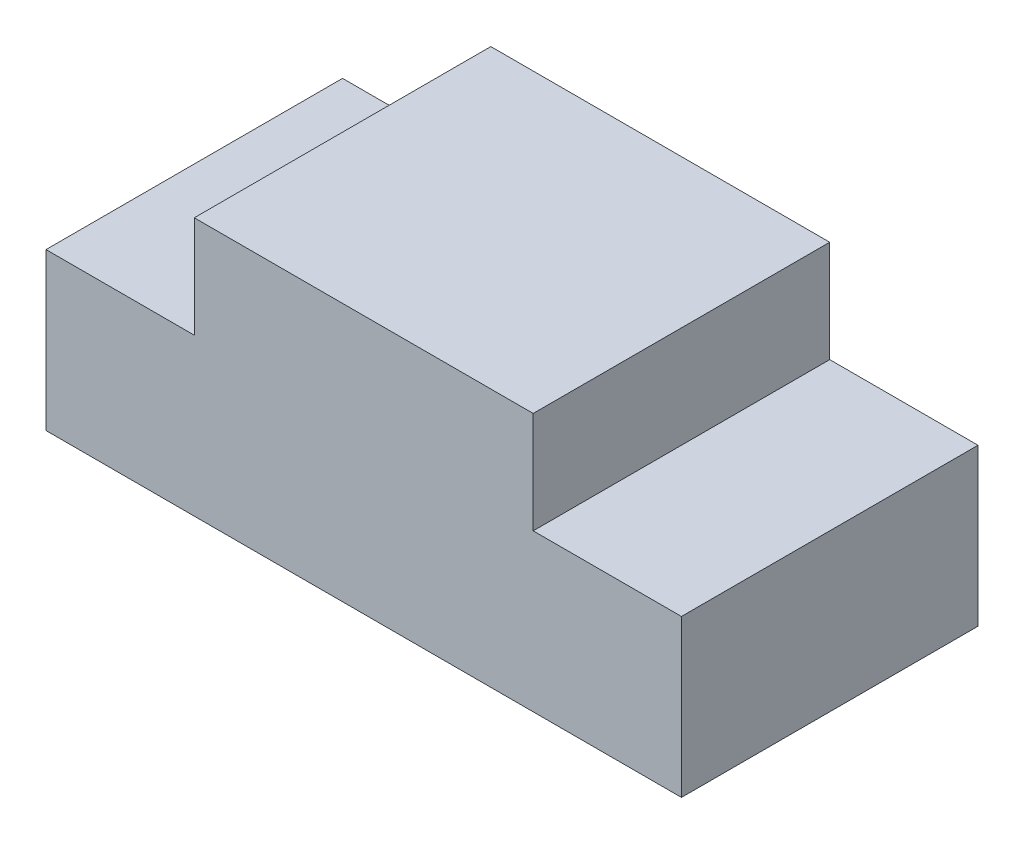
ISO-10303-21;
HEADER;
FILE_DESCRIPTION(('STEP AP214'),'2;1');
FILE_NAME('part.step','',(''),(''),'','','');
FILE_SCHEMA(('AUTOMOTIVE_DESIGN { 1 0 10303 214 1 1 1 1 }'));
ENDSEC;
DATA;
#1=APPLICATION_CONTEXT('core data for automotive mechanical design processes');
#2=APPLICATION_PROTOCOL_DEFINITION('international standard','automotive_design',2000,#1);
#3=PRODUCT_CONTEXT('',#1,'mechanical');
#4=PRODUCT('Part','Part','',(#3));
#5=PRODUCT_RELATED_PRODUCT_CATEGORY('part','',(#4));
#6=PRODUCT_DEFINITION_FORMATION('','',#4);
#7=PRODUCT_DEFINITION_CONTEXT('part definition',#1,'design');
#8=PRODUCT_DEFINITION('design','',#6,#7);
#9=PRODUCT_DEFINITION_SHAPE('','',#8);
#10=(LENGTH_UNIT() NAMED_UNIT(*) SI_UNIT(.MILLI.,.METRE.));
#11=(NAMED_UNIT(*) PLANE_ANGLE_UNIT() SI_UNIT($,.RADIAN.));
#12=(NAMED_UNIT(*) SI_UNIT($,.STERADIAN.) SOLID_ANGLE_UNIT());
#13=UNCERTAINTY_MEASURE_WITH_UNIT(LENGTH_MEASURE(1.E-05),#10,'distance_accuracy_value','');
#14=(GEOMETRIC_REPRESENTATION_CONTEXT(3) GLOBAL_UNCERTAINTY_ASSIGNED_CONTEXT((#13)) GLOBAL_UNIT_ASSIGNED_CONTEXT((#10,
#11,#12)) REPRESENTATION_CONTEXT('',''));
#15=CARTESIAN_POINT('',(0.,0.,0.));
#16=DIRECTION('',(0.,0.,1.));
#17=DIRECTION('',(1.,0.,0.));
#18=AXIS2_PLACEMENT_3D('',#15,#16,#17);
#19=CARTESIAN_POINT('',(0.,35.011641443539,0.));
#20=DIRECTION('',(0.,-1.,0.));
#21=DIRECTION('',(0.,0.,-1.));
#22=AXIS2_PLACEMENT_3D('',#19,#20,#21);
#23=PLANE('',#22);
#24=DIRECTION('',(0.,0.,1.));
#25=VECTOR('',#24,1.);
#26=CARTESIAN_POINT('',(41.0954598370198,35.011641443539,0.999999999999974));
#27=LINE('',#26,#25);
#28=CARTESIAN_POINT('',(41.0954598370198,35.011641443539,0.999999999999974));
#29=VERTEX_POINT('',#28);
#30=CARTESIAN_POINT('',(41.0954598370198,35.011641443539,69.));
#31=VERTEX_POINT('',#30);
#32=EDGE_CURVE('E162',#29,#31,#27,.T.);
#33=ORIENTED_EDGE('',*,*,#32,.F.);
#34=DIRECTION('',(-1.,0.,0.));
#35=VECTOR('',#34,1.);
#36=CARTESIAN_POINT('',(-71.9045401629802,35.011641443539,1.));
#37=LINE('',#36,#35);
#38=CARTESIAN_POINT('',(76.0954598370198,35.011641443539,1.));
#39=VERTEX_POINT('',#38);
#40=EDGE_CURVE('E265',#39,#29,#37,.T.);
#41=ORIENTED_EDGE('',*,*,#40,.F.);
#42=DIRECTION('',(0.,0.,-1.));
#43=VECTOR('',#42,1.);
#44=CARTESIAN_POINT('',(76.0954598370198,35.011641443539,69.));
#45=LINE('',#44,#43);
#46=CARTESIAN_POINT('',(76.0954598370198,35.011641443539,69.));
#47=VERTEX_POINT('',#46);
#48=EDGE_CURVE('E282',#47,#39,#45,.T.);
#49=ORIENTED_EDGE('',*,*,#48,.F.);
#50=DIRECTION('',(1.,0.,0.));
#51=VECTOR('',#50,1.);
#52=CARTESIAN_POINT('',(-71.9045401629802,35.011641443539,69.));
#53=LINE('',#52,#51);
#54=EDGE_CURVE('E278',#31,#47,#53,.T.);
#55=ORIENTED_EDGE('',*,*,#54,.F.);
#56=EDGE_LOOP('',(#33,#41,#49,#55));
#57=FACE_BOUND('',#56,.T.);
#58=ADVANCED_FACE('F39',(#57),#23,.T.);
#59=CARTESIAN_POINT('',(-72.9045401629802,35.011641443539,70.));
#60=DIRECTION('',(1.,0.,0.));
#61=DIRECTION('',(0.,1.,0.));
#62=AXIS2_PLACEMENT_3D('',#59,#60,#61);
#63=PLANE('',#62);
#64=DIRECTION('',(0.,-1.,0.));
#65=VECTOR('',#64,1.);
#66=CARTESIAN_POINT('',(-72.9045401629802,35.011641443539,0.));
#67=LINE('',#66,#65);
#68=CARTESIAN_POINT('',(-72.9045401629802,36.011641443539,0.));
#69=VERTEX_POINT('',#68);
#70=CARTESIAN_POINT('',(-72.9045401629802,-0.988358556461004,0.));
#71=VERTEX_POINT('',#70);
#72=EDGE_CURVE('E294',#69,#71,#67,.T.);
#73=ORIENTED_EDGE('',*,*,#72,.T.);
#74=DIRECTION('',(0.,0.,-1.));
#75=VECTOR('',#74,1.);
#76=CARTESIAN_POINT('',(-72.9045401629802,-0.988358556461004,70.));
#77=LINE('',#76,#75);
#78=CARTESIAN_POINT('',(-72.9045401629802,-0.988358556461004,70.));
#79=VERTEX_POINT('',#78);
#80=EDGE_CURVE('E11',#79,#71,#77,.T.);
#81=ORIENTED_EDGE('',*,*,#80,.F.);
#82=DIRECTION('',(0.,-1.,0.));
#83=VECTOR('',#82,1.);
#84=CARTESIAN_POINT('',(-72.9045401629802,35.011641443539,70.));
#85=LINE('',#84,#83);
#86=CARTESIAN_POINT('',(-72.9045401629802,36.011641443539,70.));
#87=VERTEX_POINT('',#86);
#88=EDGE_CURVE('E305',#87,#79,#85,.T.);
#89=ORIENTED_EDGE('',*,*,#88,.F.);
#90=DIRECTION('',(0.,0.,1.));
#91=VECTOR('',#90,1.);
#92=CARTESIAN_POINT('',(-72.9045401629802,36.011641443539,0.));
#93=LINE('',#92,#91);
#94=EDGE_CURVE('E251',#69,#87,#93,.T.);
#95=ORIENTED_EDGE('',*,*,#94,.F.);
#96=EDGE_LOOP('',(#73,#81,#89,#95));
#97=FACE_BOUND('',#96,.T.);
#98=ADVANCED_FACE('F41',(#97),#63,.F.);
#99=CARTESIAN_POINT('',(-72.9045401629802,-0.988358556461004,70.));
#100=DIRECTION('',(0.,1.,0.));
#101=DIRECTION('',(0.,0.,1.));
#102=AXIS2_PLACEMENT_3D('',#99,#100,#101);
#103=PLANE('',#102);
#104=DIRECTION('',(-1.,0.,0.));
#105=VECTOR('',#104,1.);
#106=CARTESIAN_POINT('',(-71.9045401629802,-0.988358556461004,1.));
#107=LINE('',#106,#105);
#108=CARTESIAN_POINT('',(76.0954598370198,-0.988358556461004,1.));
#109=VERTEX_POINT('',#108);
#110=CARTESIAN_POINT('',(-71.9045401629802,-0.988358556461004,1.));
#111=VERTEX_POINT('',#110);
#112=EDGE_CURVE('E271',#109,#111,#107,.T.);
#113=ORIENTED_EDGE('',*,*,#112,.T.);
#114=DIRECTION('',(0.,0.,1.));
#115=VECTOR('',#114,1.);
#116=CARTESIAN_POINT('',(-71.9045401629802,-0.988358556461004,69.));
#117=LINE('',#116,#115);
#118=CARTESIAN_POINT('',(-71.9045401629802,-0.988358556461004,69.));
#119=VERTEX_POINT('',#118);
#120=EDGE_CURVE('E260',#111,#119,#117,.T.);
#121=ORIENTED_EDGE('',*,*,#120,.T.);
#122=DIRECTION('',(1.,0.,0.));
#123=VECTOR('',#122,1.);
#124=CARTESIAN_POINT('',(-71.9045401629802,-0.988358556461004,69.));
#125=LINE('',#124,#123);
#126=CARTESIAN_POINT('',(76.0954598370198,-0.988358556461004,69.));
#127=VERTEX_POINT('',#126);
#128=EDGE_CURVE('E264',#119,#127,#125,.T.);
#129=ORIENTED_EDGE('',*,*,#128,.T.);
#130=DIRECTION('',(0.,0.,-1.));
#131=VECTOR('',#130,1.);
#132=CARTESIAN_POINT('',(76.0954598370198,-0.988358556461004,69.));
#133=LINE('',#132,#131);
#134=EDGE_CURVE('E63',#127,#109,#133,.T.);
#135=ORIENTED_EDGE('',*,*,#134,.T.);
#136=EDGE_LOOP('',(#113,#121,#129,#135));
#137=FACE_BOUND('',#136,.T.);
#138=DIRECTION('',(1.,0.,0.));
#139=VECTOR('',#138,1.);
#140=CARTESIAN_POINT('',(-72.9045401629802,-0.988358556461004,0.));
#141=LINE('',#140,#139);
#142=CARTESIAN_POINT('',(77.0954598370198,-0.988358556461004,0.));
#143=VERTEX_POINT('',#142);
#144=EDGE_CURVE('E319',#71,#143,#141,.T.);
#145=ORIENTED_EDGE('',*,*,#144,.T.);
#146=DIRECTION('',(0.,0.,-1.));
#147=VECTOR('',#146,1.);
#148=CARTESIAN_POINT('',(77.0954598370198,-0.988358556461004,70.));
#149=LINE('',#148,#147);
#150=CARTESIAN_POINT('',(77.0954598370198,-0.988358556461004,70.));
#151=VERTEX_POINT('',#150);
#152=EDGE_CURVE('E48',#151,#143,#149,.T.);
#153=ORIENTED_EDGE('',*,*,#152,.F.);
#154=DIRECTION('',(1.,0.,0.));
#155=VECTOR('',#154,1.);
#156=CARTESIAN_POINT('',(-72.9045401629802,-0.988358556461004,70.));
#157=LINE('',#156,#155);
#158=EDGE_CURVE('E309',#79,#151,#157,.T.);
#159=ORIENTED_EDGE('',*,*,#158,.F.);
#160=ORIENTED_EDGE('',*,*,#80,.T.);
#161=EDGE_LOOP('',(#145,#153,#159,#160));
#162=FACE_BOUND('',#161,.T.);
#163=ADVANCED_FACE('F345',(#137,#162),#103,.F.);
#164=CARTESIAN_POINT('',(77.0954598370198,35.011641443539,70.));
#165=DIRECTION('',(-1.,0.,0.));
#166=DIRECTION('',(0.,0.,1.));
#167=AXIS2_PLACEMENT_3D('',#164,#165,#166);
#168=PLANE('',#167);
#169=DIRECTION('',(0.,1.,0.));
#170=VECTOR('',#169,1.);
#171=CARTESIAN_POINT('',(77.0954598370198,35.011641443539,0.));
#172=LINE('',#171,#170);
#173=CARTESIAN_POINT('',(77.0954598370198,36.011641443539,0.));
#174=VERTEX_POINT('',#173);
#175=EDGE_CURVE('E310',#143,#174,#172,.T.);
#176=ORIENTED_EDGE('',*,*,#175,.T.);
#177=DIRECTION('',(0.,0.,-1.));
#178=VECTOR('',#177,1.);
#179=CARTESIAN_POINT('',(77.0954598370198,36.011641443539,0.));
#180=LINE('',#179,#178);
#181=CARTESIAN_POINT('',(77.0954598370198,36.011641443539,70.));
#182=VERTEX_POINT('',#181);
#183=EDGE_CURVE('E235',#182,#174,#180,.T.);
#184=ORIENTED_EDGE('',*,*,#183,.F.);
#185=DIRECTION('',(0.,1.,0.));
#186=VECTOR('',#185,1.);
#187=CARTESIAN_POINT('',(77.0954598370198,35.011641443539,70.));
#188=LINE('',#187,#186);
#189=EDGE_CURVE('E313',#151,#182,#188,.T.);
#190=ORIENTED_EDGE('',*,*,#189,.F.);
#191=ORIENTED_EDGE('',*,*,#152,.T.);
#192=EDGE_LOOP('',(#176,#184,#190,#191));
#193=FACE_BOUND('',#192,.T.);
#194=ADVANCED_FACE('F329',(#193),#168,.F.);
#195=CARTESIAN_POINT('',(0.,0.,70.));
#196=DIRECTION('',(0.,0.,1.));
#197=DIRECTION('',(1.,0.,0.));
#198=AXIS2_PLACEMENT_3D('',#195,#196,#197);
#199=PLANE('',#198);
#200=ORIENTED_EDGE('',*,*,#88,.T.);
#201=ORIENTED_EDGE('',*,*,#158,.T.);
#202=ORIENTED_EDGE('',*,*,#189,.T.);
#203=DIRECTION('',(1.,0.,0.));
#204=VECTOR('',#203,1.);
#205=CARTESIAN_POINT('',(42.0954598370198,36.011641443539,70.));
#206=LINE('',#205,#204);
#207=CARTESIAN_POINT('',(42.0954598370198,36.011641443539,70.));
#208=VERTEX_POINT('',#207);
#209=EDGE_CURVE('E231',#208,#182,#206,.T.);
#210=ORIENTED_EDGE('',*,*,#209,.F.);
#211=DIRECTION('',(0.,-1.,0.));
#212=VECTOR('',#211,1.);
#213=CARTESIAN_POINT('',(42.0954598370198,35.011641443539,70.));
#214=LINE('',#213,#212);
#215=CARTESIAN_POINT('',(42.0954598370198,60.011641443539,70.));
#216=VERTEX_POINT('',#215);
#217=EDGE_CURVE('E200',#216,#208,#214,.T.);
#218=ORIENTED_EDGE('',*,*,#217,.F.);
#219=DIRECTION('',(1.,0.,0.));
#220=VECTOR('',#219,1.);
#221=CARTESIAN_POINT('',(42.0954598370198,60.011641443539,70.));
#222=LINE('',#221,#220);
#223=CARTESIAN_POINT('',(-37.9045401629802,60.011641443539,70.));
#224=VERTEX_POINT('',#223);
#225=EDGE_CURVE('E207',#224,#216,#222,.T.);
#226=ORIENTED_EDGE('',*,*,#225,.F.);
#227=DIRECTION('',(0.,1.,0.));
#228=VECTOR('',#227,1.);
#229=CARTESIAN_POINT('',(-37.9045401629802,35.011641443539,70.));
#230=LINE('',#229,#228);
#231=CARTESIAN_POINT('',(-37.9045401629802,36.011641443539,70.));
#232=VERTEX_POINT('',#231);
#233=EDGE_CURVE('E203',#232,#224,#230,.T.);
#234=ORIENTED_EDGE('',*,*,#233,.F.);
#235=DIRECTION('',(1.,0.,0.));
#236=VECTOR('',#235,1.);
#237=CARTESIAN_POINT('',(-37.9045401629802,36.011641443539,70.));
#238=LINE('',#237,#236);
#239=EDGE_CURVE('E255',#87,#232,#238,.T.);
#240=ORIENTED_EDGE('',*,*,#239,.F.);
#241=EDGE_LOOP('',(#200,#201,#202,#210,#218,#226,#234,#240));
#242=FACE_BOUND('',#241,.T.);
#243=ADVANCED_FACE('F341',(#242),#199,.T.);
#244=CARTESIAN_POINT('',(0.,0.,0.));
#245=DIRECTION('',(0.,0.,1.));
#246=DIRECTION('',(1.,0.,0.));
#247=AXIS2_PLACEMENT_3D('',#244,#245,#246);
#248=PLANE('',#247);
#249=ORIENTED_EDGE('',*,*,#72,.F.);
#250=DIRECTION('',(-1.,0.,0.));
#251=VECTOR('',#250,1.);
#252=CARTESIAN_POINT('',(-37.9045401629802,36.011641443539,0.));
#253=LINE('',#252,#251);
#254=CARTESIAN_POINT('',(-37.9045401629802,36.011641443539,0.));
#255=VERTEX_POINT('',#254);
#256=EDGE_CURVE('E247',#255,#69,#253,.T.);
#257=ORIENTED_EDGE('',*,*,#256,.F.);
#258=DIRECTION('',(0.,1.,0.));
#259=VECTOR('',#258,1.);
#260=CARTESIAN_POINT('',(-37.9045401629802,35.011641443539,0.));
#261=LINE('',#260,#259);
#262=CARTESIAN_POINT('',(-37.9045401629802,60.011641443539,0.));
#263=VERTEX_POINT('',#262);
#264=EDGE_CURVE('E215',#255,#263,#261,.T.);
#265=ORIENTED_EDGE('',*,*,#264,.T.);
#266=DIRECTION('',(1.,0.,0.));
#267=VECTOR('',#266,1.);
#268=CARTESIAN_POINT('',(42.0954598370198,60.011641443539,0.));
#269=LINE('',#268,#267);
#270=CARTESIAN_POINT('',(42.0954598370198,60.011641443539,0.));
#271=VERTEX_POINT('',#270);
#272=EDGE_CURVE('E204',#263,#271,#269,.T.);
#273=ORIENTED_EDGE('',*,*,#272,.T.);
#274=DIRECTION('',(0.,-1.,0.));
#275=VECTOR('',#274,1.);
#276=CARTESIAN_POINT('',(42.0954598370198,35.011641443539,0.));
#277=LINE('',#276,#275);
#278=CARTESIAN_POINT('',(42.0954598370198,36.011641443539,0.));
#279=VERTEX_POINT('',#278);
#280=EDGE_CURVE('E194',#271,#279,#277,.T.);
#281=ORIENTED_EDGE('',*,*,#280,.T.);
#282=DIRECTION('',(-1.,0.,0.));
#283=VECTOR('',#282,1.);
#284=CARTESIAN_POINT('',(42.0954598370198,36.011641443539,0.));
#285=LINE('',#284,#283);
#286=EDGE_CURVE('E239',#174,#279,#285,.T.);
#287=ORIENTED_EDGE('',*,*,#286,.F.);
#288=ORIENTED_EDGE('',*,*,#175,.F.);
#289=ORIENTED_EDGE('',*,*,#144,.F.);
#290=EDGE_LOOP('',(#249,#257,#265,#273,#281,#287,#288,#289));
#291=FACE_BOUND('',#290,.T.);
#292=ADVANCED_FACE('F334',(#291),#248,.F.);
#293=CARTESIAN_POINT('',(-71.9045401629802,-0.988358556461004,69.));
#294=DIRECTION('',(-1.,0.,0.));
#295=DIRECTION('',(0.,0.,1.));
#296=AXIS2_PLACEMENT_3D('',#293,#294,#295);
#297=PLANE('',#296);
#298=DIRECTION('',(0.,0.,1.));
#299=VECTOR('',#298,1.);
#300=CARTESIAN_POINT('',(-71.9045401629802,35.011641443539,69.));
#301=LINE('',#300,#299);
#302=CARTESIAN_POINT('',(-71.9045401629802,35.011641443539,1.));
#303=VERTEX_POINT('',#302);
#304=CARTESIAN_POINT('',(-71.9045401629802,35.011641443539,69.));
#305=VERTEX_POINT('',#304);
#306=EDGE_CURVE('E259',#303,#305,#301,.T.);
#307=ORIENTED_EDGE('',*,*,#306,.T.);
#308=DIRECTION('',(0.,1.,0.));
#309=VECTOR('',#308,1.);
#310=CARTESIAN_POINT('',(-71.9045401629802,-0.988358556461004,69.));
#311=LINE('',#310,#309);
#312=EDGE_CURVE('E275',#119,#305,#311,.T.);
#313=ORIENTED_EDGE('',*,*,#312,.F.);
#314=ORIENTED_EDGE('',*,*,#120,.F.);
#315=DIRECTION('',(0.,1.,0.));
#316=VECTOR('',#315,1.);
#317=CARTESIAN_POINT('',(-71.9045401629802,-0.988358556461004,1.));
#318=LINE('',#317,#316);
#319=EDGE_CURVE('E290',#111,#303,#318,.T.);
#320=ORIENTED_EDGE('',*,*,#319,.T.);
#321=EDGE_LOOP('',(#307,#313,#314,#320));
#322=FACE_BOUND('',#321,.T.);
#323=ADVANCED_FACE('F392',(#322),#297,.F.);
#324=CARTESIAN_POINT('',(-71.9045401629802,-0.988358556461004,1.));
#325=DIRECTION('',(0.,0.,-1.));
#326=DIRECTION('',(-1.,0.,0.));
#327=AXIS2_PLACEMENT_3D('',#324,#325,#326);
#328=PLANE('',#327);
#329=ORIENTED_EDGE('',*,*,#40,.T.);
#330=DIRECTION('',(0.,-1.,0.));
#331=VECTOR('',#330,1.);
#332=CARTESIAN_POINT('',(41.0954598370198,59.011641443539,0.999999999999974));
#333=LINE('',#332,#331);
#334=CARTESIAN_POINT('',(41.0954598370198,59.011641443539,0.999999999999974));
#335=VERTEX_POINT('',#334);
#336=EDGE_CURVE('E191',#335,#29,#333,.T.);
#337=ORIENTED_EDGE('',*,*,#336,.F.);
#338=DIRECTION('',(1.,0.,0.));
#339=VECTOR('',#338,1.);
#340=CARTESIAN_POINT('',(41.0954598370198,59.011641443539,0.999999999999974));
#341=LINE('',#340,#339);
#342=CARTESIAN_POINT('',(-36.9045401629802,59.011641443539,0.999999999999973));
#343=VERTEX_POINT('',#342);
#344=EDGE_CURVE('E166',#343,#335,#341,.T.);
#345=ORIENTED_EDGE('',*,*,#344,.F.);
#346=DIRECTION('',(0.,-1.,0.));
#347=VECTOR('',#346,1.);
#348=CARTESIAN_POINT('',(-36.9045401629802,59.011641443539,0.999999999999973));
#349=LINE('',#348,#347);
#350=CARTESIAN_POINT('',(-36.9045401629802,35.011641443539,0.999999999999973));
#351=VERTEX_POINT('',#350);
#352=EDGE_CURVE('E195',#343,#351,#349,.T.);
#353=ORIENTED_EDGE('',*,*,#352,.T.);
#354=EDGE_CURVE('E286',#351,#303,#37,.T.);
#355=ORIENTED_EDGE('',*,*,#354,.T.);
#356=ORIENTED_EDGE('',*,*,#319,.F.);
#357=ORIENTED_EDGE('',*,*,#112,.F.);
#358=DIRECTION('',(0.,1.,0.));
#359=VECTOR('',#358,1.);
#360=CARTESIAN_POINT('',(76.0954598370198,-0.988358556461004,1.));
#361=LINE('',#360,#359);
#362=EDGE_CURVE('E295',#109,#39,#361,.T.);
#363=ORIENTED_EDGE('',*,*,#362,.T.);
#364=EDGE_LOOP('',(#329,#337,#345,#353,#355,#356,#357,#363));
#365=FACE_BOUND('',#364,.T.);
#366=ADVANCED_FACE('F395',(#365),#328,.F.);
#367=CARTESIAN_POINT('',(76.0954598370198,-0.988358556461004,69.));
#368=DIRECTION('',(1.,0.,0.));
#369=DIRECTION('',(0.,0.,-1.));
#370=AXIS2_PLACEMENT_3D('',#367,#368,#369);
#371=PLANE('',#370);
#372=ORIENTED_EDGE('',*,*,#48,.T.);
#373=ORIENTED_EDGE('',*,*,#362,.F.);
#374=ORIENTED_EDGE('',*,*,#134,.F.);
#375=DIRECTION('',(0.,1.,0.));
#376=VECTOR('',#375,1.);
#377=CARTESIAN_POINT('',(76.0954598370198,-0.988358556461004,69.));
#378=LINE('',#377,#376);
#379=EDGE_CURVE('E299',#127,#47,#378,.T.);
#380=ORIENTED_EDGE('',*,*,#379,.T.);
#381=EDGE_LOOP('',(#372,#373,#374,#380));
#382=FACE_BOUND('',#381,.T.);
#383=ADVANCED_FACE('F384',(#382),#371,.F.);
#384=CARTESIAN_POINT('',(-71.9045401629802,-0.988358556461004,69.));
#385=DIRECTION('',(0.,0.,1.));
#386=DIRECTION('',(1.,0.,0.));
#387=AXIS2_PLACEMENT_3D('',#384,#385,#386);
#388=PLANE('',#387);
#389=CARTESIAN_POINT('',(-36.9045401629802,35.011641443539,69.));
#390=VERTEX_POINT('',#389);
#391=EDGE_CURVE('E279',#305,#390,#53,.T.);
#392=ORIENTED_EDGE('',*,*,#391,.T.);
#393=DIRECTION('',(0.,-1.,0.));
#394=VECTOR('',#393,1.);
#395=CARTESIAN_POINT('',(-36.9045401629802,59.011641443539,69.));
#396=LINE('',#395,#394);
#397=CARTESIAN_POINT('',(-36.9045401629802,59.011641443539,69.));
#398=VERTEX_POINT('',#397);
#399=EDGE_CURVE('E55',#398,#390,#396,.T.);
#400=ORIENTED_EDGE('',*,*,#399,.F.);
#401=DIRECTION('',(-1.,0.,0.));
#402=VECTOR('',#401,1.);
#403=CARTESIAN_POINT('',(41.0954598370198,59.011641443539,69.));
#404=LINE('',#403,#402);
#405=CARTESIAN_POINT('',(41.0954598370198,59.011641443539,69.));
#406=VERTEX_POINT('',#405);
#407=EDGE_CURVE('E169',#406,#398,#404,.T.);
#408=ORIENTED_EDGE('',*,*,#407,.F.);
#409=DIRECTION('',(0.,-1.,0.));
#410=VECTOR('',#409,1.);
#411=CARTESIAN_POINT('',(41.0954598370198,59.011641443539,69.));
#412=LINE('',#411,#410);
#413=EDGE_CURVE('E155',#406,#31,#412,.T.);
#414=ORIENTED_EDGE('',*,*,#413,.T.);
#415=ORIENTED_EDGE('',*,*,#54,.T.);
#416=ORIENTED_EDGE('',*,*,#379,.F.);
#417=ORIENTED_EDGE('',*,*,#128,.F.);
#418=ORIENTED_EDGE('',*,*,#312,.T.);
#419=EDGE_LOOP('',(#392,#400,#408,#414,#415,#416,#417,#418));
#420=FACE_BOUND('',#419,.T.);
#421=ADVANCED_FACE('F171',(#420),#388,.F.);
#422=DIRECTION('',(0.,0.,-1.));
#423=VECTOR('',#422,1.);
#424=CARTESIAN_POINT('',(-36.9045401629802,35.011641443539,0.999999999999973));
#425=LINE('',#424,#423);
#426=EDGE_CURVE('E180',#390,#351,#425,.T.);
#427=ORIENTED_EDGE('',*,*,#426,.F.);
#428=ORIENTED_EDGE('',*,*,#391,.F.);
#429=ORIENTED_EDGE('',*,*,#306,.F.);
#430=ORIENTED_EDGE('',*,*,#354,.F.);
#431=EDGE_LOOP('',(#427,#428,#429,#430));
#432=FACE_BOUND('',#431,.T.);
#433=ADVANCED_FACE('F372',(#432),#23,.T.);
#434=CARTESIAN_POINT('',(0.,36.011641443539,0.));
#435=DIRECTION('',(0.,-1.,0.));
#436=DIRECTION('',(0.,0.,-1.));
#437=AXIS2_PLACEMENT_3D('',#434,#435,#436);
#438=PLANE('',#437);
#439=DIRECTION('',(0.,0.,-1.));
#440=VECTOR('',#439,1.);
#441=CARTESIAN_POINT('',(-37.9045401629802,36.011641443539,0.));
#442=LINE('',#441,#440);
#443=EDGE_CURVE('E243',#232,#255,#442,.T.);
#444=ORIENTED_EDGE('',*,*,#443,.T.);
#445=ORIENTED_EDGE('',*,*,#256,.T.);
#446=ORIENTED_EDGE('',*,*,#94,.T.);
#447=ORIENTED_EDGE('',*,*,#239,.T.);
#448=EDGE_LOOP('',(#444,#445,#446,#447));
#449=FACE_BOUND('',#448,.T.);
#450=ADVANCED_FACE('F350',(#449),#438,.F.);
#451=CARTESIAN_POINT('',(0.,36.011641443539,0.));
#452=DIRECTION('',(0.,1.,0.));
#453=DIRECTION('',(0.,0.,1.));
#454=AXIS2_PLACEMENT_3D('',#451,#452,#453);
#455=PLANE('',#454);
#456=DIRECTION('',(0.,0.,1.));
#457=VECTOR('',#456,1.);
#458=CARTESIAN_POINT('',(42.0954598370198,36.011641443539,0.));
#459=LINE('',#458,#457);
#460=EDGE_CURVE('E224',#279,#208,#459,.T.);
#461=ORIENTED_EDGE('',*,*,#460,.T.);
#462=ORIENTED_EDGE('',*,*,#209,.T.);
#463=ORIENTED_EDGE('',*,*,#183,.T.);
#464=ORIENTED_EDGE('',*,*,#286,.T.);
#465=EDGE_LOOP('',(#461,#462,#463,#464));
#466=FACE_BOUND('',#465,.T.);
#467=ADVANCED_FACE('F337',(#466),#455,.T.);
#468=CARTESIAN_POINT('',(42.0954598370198,60.011641443539,70.));
#469=DIRECTION('',(0.,1.,0.));
#470=DIRECTION('',(0.,0.,1.));
#471=AXIS2_PLACEMENT_3D('',#468,#469,#470);
#472=PLANE('',#471);
#473=ORIENTED_EDGE('',*,*,#272,.F.);
#474=DIRECTION('',(0.,0.,-1.));
#475=VECTOR('',#474,1.);
#476=CARTESIAN_POINT('',(-37.9045401629802,60.011641443539,70.));
#477=LINE('',#476,#475);
#478=EDGE_CURVE('E211',#224,#263,#477,.T.);
#479=ORIENTED_EDGE('',*,*,#478,.F.);
#480=ORIENTED_EDGE('',*,*,#225,.T.);
#481=DIRECTION('',(0.,0.,-1.));
#482=VECTOR('',#481,1.);
#483=CARTESIAN_POINT('',(42.0954598370198,60.011641443539,70.));
#484=LINE('',#483,#482);
#485=EDGE_CURVE('E221',#216,#271,#484,.T.);
#486=ORIENTED_EDGE('',*,*,#485,.T.);
#487=EDGE_LOOP('',(#473,#479,#480,#486));
#488=FACE_BOUND('',#487,.T.);
#489=ADVANCED_FACE('F357',(#488),#472,.T.);
#490=CARTESIAN_POINT('',(42.0954598370198,35.011641443539,70.));
#491=DIRECTION('',(1.,0.,0.));
#492=DIRECTION('',(0.,0.,-1.));
#493=AXIS2_PLACEMENT_3D('',#490,#491,#492);
#494=PLANE('',#493);
#495=ORIENTED_EDGE('',*,*,#217,.T.);
#496=ORIENTED_EDGE('',*,*,#460,.F.);
#497=ORIENTED_EDGE('',*,*,#280,.F.);
#498=ORIENTED_EDGE('',*,*,#485,.F.);
#499=EDGE_LOOP('',(#495,#496,#497,#498));
#500=FACE_BOUND('',#499,.T.);
#501=ADVANCED_FACE('F359',(#500),#494,.T.);
#502=CARTESIAN_POINT('',(-37.9045401629802,35.011641443539,70.));
#503=DIRECTION('',(-1.,0.,0.));
#504=DIRECTION('',(0.,0.,1.));
#505=AXIS2_PLACEMENT_3D('',#502,#503,#504);
#506=PLANE('',#505);
#507=ORIENTED_EDGE('',*,*,#443,.F.);
#508=ORIENTED_EDGE('',*,*,#233,.T.);
#509=ORIENTED_EDGE('',*,*,#478,.T.);
#510=ORIENTED_EDGE('',*,*,#264,.F.);
#511=EDGE_LOOP('',(#507,#508,#509,#510));
#512=FACE_BOUND('',#511,.T.);
#513=ADVANCED_FACE('F353',(#512),#506,.T.);
#514=CARTESIAN_POINT('',(41.0954598370198,59.011641443539,0.999999999999974));
#515=DIRECTION('',(1.,0.,0.));
#516=DIRECTION('',(0.,0.,-1.));
#517=AXIS2_PLACEMENT_3D('',#514,#515,#516);
#518=PLANE('',#517);
#519=ORIENTED_EDGE('',*,*,#32,.T.);
#520=ORIENTED_EDGE('',*,*,#413,.F.);
#521=DIRECTION('',(0.,0.,1.));
#522=VECTOR('',#521,1.);
#523=CARTESIAN_POINT('',(41.0954598370198,59.011641443539,0.999999999999974));
#524=LINE('',#523,#522);
#525=EDGE_CURVE('E159',#335,#406,#524,.T.);
#526=ORIENTED_EDGE('',*,*,#525,.F.);
#527=ORIENTED_EDGE('',*,*,#336,.T.);
#528=EDGE_LOOP('',(#519,#520,#526,#527));
#529=FACE_BOUND('',#528,.T.);
#530=ADVANCED_FACE('F157',(#529),#518,.F.);
#531=CARTESIAN_POINT('',(-36.9045401629802,59.011641443539,0.999999999999973));
#532=DIRECTION('',(-1.,0.,0.));
#533=DIRECTION('',(0.,0.,1.));
#534=AXIS2_PLACEMENT_3D('',#531,#532,#533);
#535=PLANE('',#534);
#536=ORIENTED_EDGE('',*,*,#426,.T.);
#537=ORIENTED_EDGE('',*,*,#352,.F.);
#538=DIRECTION('',(0.,0.,-1.));
#539=VECTOR('',#538,1.);
#540=CARTESIAN_POINT('',(-36.9045401629802,59.011641443539,0.999999999999973));
#541=LINE('',#540,#539);
#542=EDGE_CURVE('E175',#398,#343,#541,.T.);
#543=ORIENTED_EDGE('',*,*,#542,.F.);
#544=ORIENTED_EDGE('',*,*,#399,.T.);
#545=EDGE_LOOP('',(#536,#537,#543,#544));
#546=FACE_BOUND('',#545,.T.);
#547=ADVANCED_FACE('F465',(#546),#535,.F.);
#548=CARTESIAN_POINT('',(0.,59.011641443539,0.));
#549=DIRECTION('',(0.,-1.,0.));
#550=DIRECTION('',(0.,0.,-1.));
#551=AXIS2_PLACEMENT_3D('',#548,#549,#550);
#552=PLANE('',#551);
#553=ORIENTED_EDGE('',*,*,#525,.T.);
#554=ORIENTED_EDGE('',*,*,#407,.T.);
#555=ORIENTED_EDGE('',*,*,#542,.T.);
#556=ORIENTED_EDGE('',*,*,#344,.T.);
#557=EDGE_LOOP('',(#553,#554,#555,#556));
#558=FACE_BOUND('',#557,.T.);
#559=ADVANCED_FACE('F177',(#558),#552,.T.);
#560=CLOSED_SHELL('',(#58,#98,#163,#194,#243,#292,#323,#366,#383,#421,#433,#450,#467,#489,#501,
#513,#530,#547,#559));
#561=MANIFOLD_SOLID_BREP('B2',#560);
#562=ADVANCED_BREP_SHAPE_REPRESENTATION('',(#18,#561),#14);
#563=SHAPE_DEFINITION_REPRESENTATION(#9,#562);
ENDSEC;
END-ISO-10303-21;
